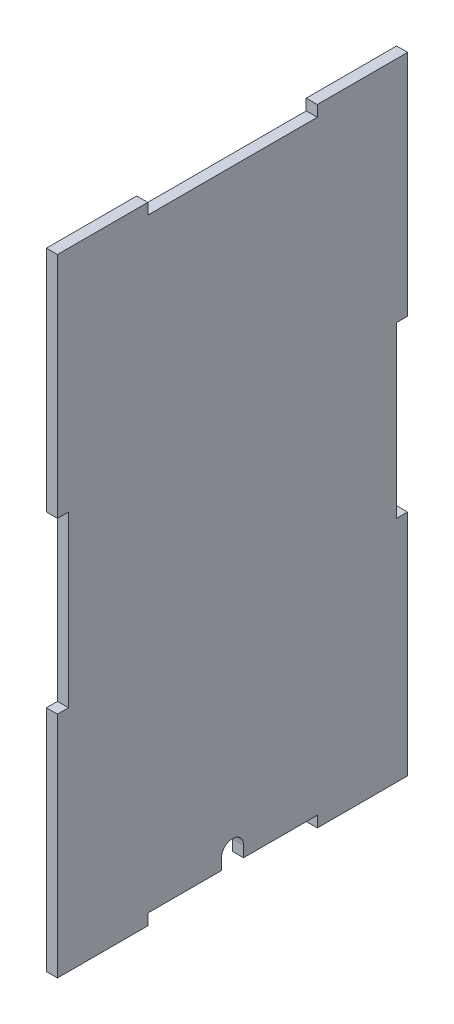
ISO-10303-21;
HEADER;
FILE_DESCRIPTION(('STEP AP214'),'2;1');
FILE_NAME('part.step','',(''),(''),'','','');
FILE_SCHEMA(('AUTOMOTIVE_DESIGN { 1 0 10303 214 1 1 1 1 }'));
ENDSEC;
DATA;
#1=APPLICATION_CONTEXT('core data for automotive mechanical design processes');
#2=APPLICATION_PROTOCOL_DEFINITION('international standard','automotive_design',2000,#1);
#3=PRODUCT_CONTEXT('',#1,'mechanical');
#4=PRODUCT('Part','Part','',(#3));
#5=PRODUCT_RELATED_PRODUCT_CATEGORY('part','',(#4));
#6=PRODUCT_DEFINITION_FORMATION('','',#4);
#7=PRODUCT_DEFINITION_CONTEXT('part definition',#1,'design');
#8=PRODUCT_DEFINITION('design','',#6,#7);
#9=PRODUCT_DEFINITION_SHAPE('','',#8);
#10=(LENGTH_UNIT() NAMED_UNIT(*) SI_UNIT(.MILLI.,.METRE.));
#11=(NAMED_UNIT(*) PLANE_ANGLE_UNIT() SI_UNIT($,.RADIAN.));
#12=(NAMED_UNIT(*) SI_UNIT($,.STERADIAN.) SOLID_ANGLE_UNIT());
#13=UNCERTAINTY_MEASURE_WITH_UNIT(LENGTH_MEASURE(1.E-05),#10,'distance_accuracy_value','');
#14=(GEOMETRIC_REPRESENTATION_CONTEXT(3) GLOBAL_UNCERTAINTY_ASSIGNED_CONTEXT((#13)) GLOBAL_UNIT_ASSIGNED_CONTEXT((#10,
#11,#12)) REPRESENTATION_CONTEXT('',''));
#15=CARTESIAN_POINT('',(0.,0.,0.));
#16=DIRECTION('',(0.,0.,1.));
#17=DIRECTION('',(1.,0.,0.));
#18=AXIS2_PLACEMENT_3D('',#15,#16,#17);
#19=CARTESIAN_POINT('',(3.,170.,0.));
#20=DIRECTION('',(0.,0.,-1.));
#21=DIRECTION('',(0.,1.,0.));
#22=AXIS2_PLACEMENT_3D('',#19,#20,#21);
#23=PLANE('',#22);
#24=DIRECTION('',(0.,-1.,0.));
#25=VECTOR('',#24,1.);
#26=CARTESIAN_POINT('',(0.,170.,0.));
#27=LINE('',#26,#25);
#28=CARTESIAN_POINT('',(0.,170.,0.));
#29=VERTEX_POINT('',#28);
#30=CARTESIAN_POINT('',(0.,108.,0.));
#31=VERTEX_POINT('',#30);
#32=EDGE_CURVE('E236',#29,#31,#27,.T.);
#33=ORIENTED_EDGE('',*,*,#32,.T.);
#34=DIRECTION('',(-1.,0.,0.));
#35=VECTOR('',#34,1.);
#36=CARTESIAN_POINT('',(3.,108.,0.));
#37=LINE('',#36,#35);
#38=CARTESIAN_POINT('',(3.,108.,0.));
#39=VERTEX_POINT('',#38);
#40=EDGE_CURVE('E11',#39,#31,#37,.T.);
#41=ORIENTED_EDGE('',*,*,#40,.F.);
#42=DIRECTION('',(0.,-1.,0.));
#43=VECTOR('',#42,1.);
#44=CARTESIAN_POINT('',(3.,170.,0.));
#45=LINE('',#44,#43);
#46=CARTESIAN_POINT('',(3.,170.,0.));
#47=VERTEX_POINT('',#46);
#48=EDGE_CURVE('E306',#47,#39,#45,.T.);
#49=ORIENTED_EDGE('',*,*,#48,.F.);
#50=DIRECTION('',(-1.,0.,0.));
#51=VECTOR('',#50,1.);
#52=CARTESIAN_POINT('',(3.,170.,0.));
#53=LINE('',#52,#51);
#54=EDGE_CURVE('E232',#47,#29,#53,.T.);
#55=ORIENTED_EDGE('',*,*,#54,.T.);
#56=EDGE_LOOP('',(#33,#41,#49,#55));
#57=FACE_BOUND('',#56,.T.);
#58=ADVANCED_FACE('F39',(#57),#23,.F.);
#59=CARTESIAN_POINT('',(3.,108.,-2.99999999999999));
#60=DIRECTION('',(0.,1.,0.));
#61=DIRECTION('',(0.,0.,1.));
#62=AXIS2_PLACEMENT_3D('',#59,#60,#61);
#63=PLANE('',#62);
#64=DIRECTION('',(0.,0.,-1.));
#65=VECTOR('',#64,1.);
#66=CARTESIAN_POINT('',(0.,108.,-2.99999999999999));
#67=LINE('',#66,#65);
#68=CARTESIAN_POINT('',(0.,108.,-2.99999999999999));
#69=VERTEX_POINT('',#68);
#70=EDGE_CURVE('E240',#31,#69,#67,.T.);
#71=ORIENTED_EDGE('',*,*,#70,.T.);
#72=DIRECTION('',(-1.,0.,0.));
#73=VECTOR('',#72,1.);
#74=CARTESIAN_POINT('',(3.,108.,-2.99999999999999));
#75=LINE('',#74,#73);
#76=CARTESIAN_POINT('',(3.,108.,-2.99999999999999));
#77=VERTEX_POINT('',#76);
#78=EDGE_CURVE('E48',#77,#69,#75,.T.);
#79=ORIENTED_EDGE('',*,*,#78,.F.);
#80=DIRECTION('',(0.,0.,-1.));
#81=VECTOR('',#80,1.);
#82=CARTESIAN_POINT('',(3.,108.,-2.99999999999999));
#83=LINE('',#82,#81);
#84=EDGE_CURVE('E147',#39,#77,#83,.T.);
#85=ORIENTED_EDGE('',*,*,#84,.F.);
#86=ORIENTED_EDGE('',*,*,#40,.T.);
#87=EDGE_LOOP('',(#71,#79,#85,#86));
#88=FACE_BOUND('',#87,.T.);
#89=ADVANCED_FACE('F484',(#88),#63,.F.);
#90=CARTESIAN_POINT('',(3.,62.,-2.99999999999999));
#91=DIRECTION('',(0.,0.,-1.));
#92=DIRECTION('',(-1.,0.,0.));
#93=AXIS2_PLACEMENT_3D('',#90,#91,#92);
#94=PLANE('',#93);
#95=DIRECTION('',(0.,-1.,0.));
#96=VECTOR('',#95,1.);
#97=CARTESIAN_POINT('',(0.,62.,-2.99999999999999));
#98=LINE('',#97,#96);
#99=CARTESIAN_POINT('',(0.,62.,-2.99999999999999));
#100=VERTEX_POINT('',#99);
#101=EDGE_CURVE('E243',#69,#100,#98,.T.);
#102=ORIENTED_EDGE('',*,*,#101,.T.);
#103=DIRECTION('',(-1.,0.,0.));
#104=VECTOR('',#103,1.);
#105=CARTESIAN_POINT('',(3.,62.,-2.99999999999999));
#106=LINE('',#105,#104);
#107=CARTESIAN_POINT('',(3.,62.,-2.99999999999999));
#108=VERTEX_POINT('',#107);
#109=EDGE_CURVE('E381',#108,#100,#106,.T.);
#110=ORIENTED_EDGE('',*,*,#109,.F.);
#111=DIRECTION('',(0.,-1.,0.));
#112=VECTOR('',#111,1.);
#113=CARTESIAN_POINT('',(3.,62.,-2.99999999999999));
#114=LINE('',#113,#112);
#115=EDGE_CURVE('E391',#77,#108,#114,.T.);
#116=ORIENTED_EDGE('',*,*,#115,.F.);
#117=ORIENTED_EDGE('',*,*,#78,.T.);
#118=EDGE_LOOP('',(#102,#110,#116,#117));
#119=FACE_BOUND('',#118,.T.);
#120=ADVANCED_FACE('F389',(#119),#94,.F.);
#121=CARTESIAN_POINT('',(3.,62.,-2.99999999999999));
#122=DIRECTION('',(0.,-1.,0.));
#123=DIRECTION('',(0.,0.,-1.));
#124=AXIS2_PLACEMENT_3D('',#121,#122,#123);
#125=PLANE('',#124);
#126=DIRECTION('',(0.,0.,1.));
#127=VECTOR('',#126,1.);
#128=CARTESIAN_POINT('',(0.,62.,-2.99999999999999));
#129=LINE('',#128,#127);
#130=CARTESIAN_POINT('',(0.,62.,0.));
#131=VERTEX_POINT('',#130);
#132=EDGE_CURVE('E246',#100,#131,#129,.T.);
#133=ORIENTED_EDGE('',*,*,#132,.T.);
#134=DIRECTION('',(-1.,0.,0.));
#135=VECTOR('',#134,1.);
#136=CARTESIAN_POINT('',(3.,62.,0.));
#137=LINE('',#136,#135);
#138=CARTESIAN_POINT('',(3.,62.,0.));
#139=VERTEX_POINT('',#138);
#140=EDGE_CURVE('E377',#139,#131,#137,.T.);
#141=ORIENTED_EDGE('',*,*,#140,.F.);
#142=DIRECTION('',(0.,0.,1.));
#143=VECTOR('',#142,1.);
#144=CARTESIAN_POINT('',(3.,62.,-2.99999999999999));
#145=LINE('',#144,#143);
#146=EDGE_CURVE('E410',#108,#139,#145,.T.);
#147=ORIENTED_EDGE('',*,*,#146,.F.);
#148=ORIENTED_EDGE('',*,*,#109,.T.);
#149=EDGE_LOOP('',(#133,#141,#147,#148));
#150=FACE_BOUND('',#149,.T.);
#151=ADVANCED_FACE('F400',(#150),#125,.F.);
#152=CARTESIAN_POINT('',(3.,62.,0.));
#153=DIRECTION('',(0.,0.,-1.));
#154=DIRECTION('',(0.,1.,0.));
#155=AXIS2_PLACEMENT_3D('',#152,#153,#154);
#156=PLANE('',#155);
#157=DIRECTION('',(0.,-1.,0.));
#158=VECTOR('',#157,1.);
#159=CARTESIAN_POINT('',(0.,62.,0.));
#160=LINE('',#159,#158);
#161=CARTESIAN_POINT('',(0.,0.,0.));
#162=VERTEX_POINT('',#161);
#163=EDGE_CURVE('E249',#131,#162,#160,.T.);
#164=ORIENTED_EDGE('',*,*,#163,.T.);
#165=DIRECTION('',(-1.,0.,0.));
#166=VECTOR('',#165,1.);
#167=CARTESIAN_POINT('',(3.,0.,0.));
#168=LINE('',#167,#166);
#169=CARTESIAN_POINT('',(3.,0.,0.));
#170=VERTEX_POINT('',#169);
#171=EDGE_CURVE('E373',#170,#162,#168,.T.);
#172=ORIENTED_EDGE('',*,*,#171,.F.);
#173=DIRECTION('',(0.,-1.,0.));
#174=VECTOR('',#173,1.);
#175=CARTESIAN_POINT('',(3.,62.,0.));
#176=LINE('',#175,#174);
#177=EDGE_CURVE('E406',#139,#170,#176,.T.);
#178=ORIENTED_EDGE('',*,*,#177,.F.);
#179=ORIENTED_EDGE('',*,*,#140,.T.);
#180=EDGE_LOOP('',(#164,#172,#178,#179));
#181=FACE_BOUND('',#180,.T.);
#182=ADVANCED_FACE('F404',(#181),#156,.F.);
#183=CARTESIAN_POINT('',(3.,0.,0.));
#184=DIRECTION('',(0.,1.,0.));
#185=DIRECTION('',(0.,0.,1.));
#186=AXIS2_PLACEMENT_3D('',#183,#184,#185);
#187=PLANE('',#186);
#188=DIRECTION('',(0.,0.,-1.));
#189=VECTOR('',#188,1.);
#190=CARTESIAN_POINT('',(0.,0.,0.));
#191=LINE('',#190,#189);
#192=CARTESIAN_POINT('',(0.,0.,-24.4999999999999));
#193=VERTEX_POINT('',#192);
#194=EDGE_CURVE('E252',#162,#193,#191,.T.);
#195=ORIENTED_EDGE('',*,*,#194,.T.);
#196=DIRECTION('',(-1.,0.,0.));
#197=VECTOR('',#196,1.);
#198=CARTESIAN_POINT('',(3.,0.,-24.4999999999999));
#199=LINE('',#198,#197);
#200=CARTESIAN_POINT('',(3.,0.,-24.4999999999999));
#201=VERTEX_POINT('',#200);
#202=EDGE_CURVE('E369',#201,#193,#199,.T.);
#203=ORIENTED_EDGE('',*,*,#202,.F.);
#204=DIRECTION('',(0.,0.,-1.));
#205=VECTOR('',#204,1.);
#206=CARTESIAN_POINT('',(3.,0.,0.));
#207=LINE('',#206,#205);
#208=EDGE_CURVE('E409',#170,#201,#207,.T.);
#209=ORIENTED_EDGE('',*,*,#208,.F.);
#210=ORIENTED_EDGE('',*,*,#171,.T.);
#211=EDGE_LOOP('',(#195,#203,#209,#210));
#212=FACE_BOUND('',#211,.T.);
#213=ADVANCED_FACE('F497',(#212),#187,.F.);
#214=CARTESIAN_POINT('',(3.,3.00000000000002,-24.4999999999999));
#215=DIRECTION('',(0.,0.,1.));
#216=DIRECTION('',(1.,0.,0.));
#217=AXIS2_PLACEMENT_3D('',#214,#215,#216);
#218=PLANE('',#217);
#219=DIRECTION('',(0.,1.,0.));
#220=VECTOR('',#219,1.);
#221=CARTESIAN_POINT('',(0.,3.00000000000002,-24.4999999999999));
#222=LINE('',#221,#220);
#223=CARTESIAN_POINT('',(0.,3.00000000000002,-24.4999999999999));
#224=VERTEX_POINT('',#223);
#225=EDGE_CURVE('E255',#193,#224,#222,.T.);
#226=ORIENTED_EDGE('',*,*,#225,.T.);
#227=DIRECTION('',(-1.,0.,0.));
#228=VECTOR('',#227,1.);
#229=CARTESIAN_POINT('',(3.,3.00000000000002,-24.4999999999999));
#230=LINE('',#229,#228);
#231=CARTESIAN_POINT('',(3.,3.00000000000002,-24.4999999999999));
#232=VERTEX_POINT('',#231);
#233=EDGE_CURVE('E365',#232,#224,#230,.T.);
#234=ORIENTED_EDGE('',*,*,#233,.F.);
#235=DIRECTION('',(0.,1.,0.));
#236=VECTOR('',#235,1.);
#237=CARTESIAN_POINT('',(3.,3.00000000000002,-24.4999999999999));
#238=LINE('',#237,#236);
#239=EDGE_CURVE('E414',#201,#232,#238,.T.);
#240=ORIENTED_EDGE('',*,*,#239,.F.);
#241=ORIENTED_EDGE('',*,*,#202,.T.);
#242=EDGE_LOOP('',(#226,#234,#240,#241));
#243=FACE_BOUND('',#242,.T.);
#244=ADVANCED_FACE('F500',(#243),#218,.F.);
#245=CARTESIAN_POINT('',(3.,3.00000000000002,-24.4999999999999));
#246=DIRECTION('',(0.,1.,0.));
#247=DIRECTION('',(0.,0.,1.));
#248=AXIS2_PLACEMENT_3D('',#245,#246,#247);
#249=PLANE('',#248);
#250=DIRECTION('',(0.,0.,-1.));
#251=VECTOR('',#250,1.);
#252=CARTESIAN_POINT('',(0.,3.00000000000002,-24.4999999999999));
#253=LINE('',#252,#251);
#254=CARTESIAN_POINT('',(0.,3.00000000000002,-44.5000000000001));
#255=VERTEX_POINT('',#254);
#256=EDGE_CURVE('E258',#224,#255,#253,.T.);
#257=ORIENTED_EDGE('',*,*,#256,.T.);
#258=DIRECTION('',(-1.,0.,0.));
#259=VECTOR('',#258,1.);
#260=CARTESIAN_POINT('',(3.,3.00000000000002,-44.5000000000001));
#261=LINE('',#260,#259);
#262=CARTESIAN_POINT('',(3.,3.00000000000002,-44.5000000000001));
#263=VERTEX_POINT('',#262);
#264=EDGE_CURVE('E361',#263,#255,#261,.T.);
#265=ORIENTED_EDGE('',*,*,#264,.F.);
#266=DIRECTION('',(0.,0.,-1.));
#267=VECTOR('',#266,1.);
#268=CARTESIAN_POINT('',(3.,3.00000000000002,-24.4999999999999));
#269=LINE('',#268,#267);
#270=EDGE_CURVE('E421',#232,#263,#269,.T.);
#271=ORIENTED_EDGE('',*,*,#270,.F.);
#272=ORIENTED_EDGE('',*,*,#233,.T.);
#273=EDGE_LOOP('',(#257,#265,#271,#272));
#274=FACE_BOUND('',#273,.T.);
#275=ADVANCED_FACE('F504',(#274),#249,.F.);
#276=CARTESIAN_POINT('',(3.,3.00000000000002,-44.5000000000001));
#277=DIRECTION('',(0.,0.,1.));
#278=DIRECTION('',(1.,0.,0.));
#279=AXIS2_PLACEMENT_3D('',#276,#277,#278);
#280=PLANE('',#279);
#281=DIRECTION('',(0.,1.,0.));
#282=VECTOR('',#281,1.);
#283=CARTESIAN_POINT('',(0.,3.00000000000002,-44.5000000000001));
#284=LINE('',#283,#282);
#285=CARTESIAN_POINT('',(0.,6.00000000000002,-44.5000000000001));
#286=VERTEX_POINT('',#285);
#287=EDGE_CURVE('E261',#255,#286,#284,.T.);
#288=ORIENTED_EDGE('',*,*,#287,.T.);
#289=DIRECTION('',(-1.,0.,0.));
#290=VECTOR('',#289,1.);
#291=CARTESIAN_POINT('',(3.,6.00000000000002,-44.5000000000001));
#292=LINE('',#291,#290);
#293=CARTESIAN_POINT('',(3.,6.00000000000002,-44.5000000000001));
#294=VERTEX_POINT('',#293);
#295=EDGE_CURVE('E357',#294,#286,#292,.T.);
#296=ORIENTED_EDGE('',*,*,#295,.F.);
#297=DIRECTION('',(0.,1.,0.));
#298=VECTOR('',#297,1.);
#299=CARTESIAN_POINT('',(3.,3.00000000000002,-44.5000000000001));
#300=LINE('',#299,#298);
#301=EDGE_CURVE('E424',#263,#294,#300,.T.);
#302=ORIENTED_EDGE('',*,*,#301,.F.);
#303=ORIENTED_EDGE('',*,*,#264,.T.);
#304=EDGE_LOOP('',(#288,#296,#302,#303));
#305=FACE_BOUND('',#304,.T.);
#306=ADVANCED_FACE('F508',(#305),#280,.F.);
#307=CARTESIAN_POINT('',(3.,6.00000000000002,-47.5000000000001));
#308=DIRECTION('',(-1.,0.,0.));
#309=DIRECTION('',(0.,0.,1.));
#310=AXIS2_PLACEMENT_3D('',#307,#308,#309);
#311=CYLINDRICAL_SURFACE('',#310,3.);
#312=CARTESIAN_POINT('',(0.,6.00000000000002,-47.5000000000001));
#313=DIRECTION('',(-1.,0.,0.));
#314=DIRECTION('',(0.,0.,1.));
#315=AXIS2_PLACEMENT_3D('',#312,#313,#314);
#316=CIRCLE('',#315,3.);
#317=CARTESIAN_POINT('',(0.,6.00000000000002,-50.5000000000001));
#318=VERTEX_POINT('',#317);
#319=EDGE_CURVE('E264',#286,#318,#316,.T.);
#320=ORIENTED_EDGE('',*,*,#319,.T.);
#321=DIRECTION('',(-1.,0.,0.));
#322=VECTOR('',#321,1.);
#323=CARTESIAN_POINT('',(3.,6.00000000000002,-50.5000000000001));
#324=LINE('',#323,#322);
#325=CARTESIAN_POINT('',(3.,6.00000000000002,-50.5000000000001));
#326=VERTEX_POINT('',#325);
#327=EDGE_CURVE('E353',#326,#318,#324,.T.);
#328=ORIENTED_EDGE('',*,*,#327,.F.);
#329=CARTESIAN_POINT('',(3.,6.00000000000002,-47.5000000000001));
#330=DIRECTION('',(-1.,0.,0.));
#331=DIRECTION('',(0.,0.,1.));
#332=AXIS2_PLACEMENT_3D('',#329,#330,#331);
#333=CIRCLE('',#332,3.);
#334=EDGE_CURVE('E427',#294,#326,#333,.T.);
#335=ORIENTED_EDGE('',*,*,#334,.F.);
#336=ORIENTED_EDGE('',*,*,#295,.T.);
#337=EDGE_LOOP('',(#320,#328,#335,#336));
#338=FACE_BOUND('',#337,.T.);
#339=ADVANCED_FACE('F512',(#338),#311,.F.);
#340=CARTESIAN_POINT('',(3.,3.00000000000002,-50.5000000000001));
#341=DIRECTION('',(0.,0.,-1.));
#342=DIRECTION('',(-1.,0.,0.));
#343=AXIS2_PLACEMENT_3D('',#340,#341,#342);
#344=PLANE('',#343);
#345=DIRECTION('',(0.,-1.,0.));
#346=VECTOR('',#345,1.);
#347=CARTESIAN_POINT('',(0.,3.00000000000002,-50.5000000000001));
#348=LINE('',#347,#346);
#349=CARTESIAN_POINT('',(0.,3.00000000000002,-50.5000000000001));
#350=VERTEX_POINT('',#349);
#351=EDGE_CURVE('E267',#318,#350,#348,.T.);
#352=ORIENTED_EDGE('',*,*,#351,.T.);
#353=DIRECTION('',(-1.,0.,0.));
#354=VECTOR('',#353,1.);
#355=CARTESIAN_POINT('',(3.,3.00000000000002,-50.5000000000001));
#356=LINE('',#355,#354);
#357=CARTESIAN_POINT('',(3.,3.00000000000002,-50.5000000000001));
#358=VERTEX_POINT('',#357);
#359=EDGE_CURVE('E349',#358,#350,#356,.T.);
#360=ORIENTED_EDGE('',*,*,#359,.F.);
#361=DIRECTION('',(0.,-1.,0.));
#362=VECTOR('',#361,1.);
#363=CARTESIAN_POINT('',(3.,3.00000000000002,-50.5000000000001));
#364=LINE('',#363,#362);
#365=EDGE_CURVE('E430',#326,#358,#364,.T.);
#366=ORIENTED_EDGE('',*,*,#365,.F.);
#367=ORIENTED_EDGE('',*,*,#327,.T.);
#368=EDGE_LOOP('',(#352,#360,#366,#367));
#369=FACE_BOUND('',#368,.T.);
#370=ADVANCED_FACE('F516',(#369),#344,.F.);
#371=CARTESIAN_POINT('',(3.,3.00000000000002,-50.5000000000001));
#372=DIRECTION('',(0.,1.,0.));
#373=DIRECTION('',(0.,0.,1.));
#374=AXIS2_PLACEMENT_3D('',#371,#372,#373);
#375=PLANE('',#374);
#376=DIRECTION('',(0.,0.,-1.));
#377=VECTOR('',#376,1.);
#378=CARTESIAN_POINT('',(0.,3.00000000000002,-50.5000000000001));
#379=LINE('',#378,#377);
#380=CARTESIAN_POINT('',(0.,3.,-70.4999999999999));
#381=VERTEX_POINT('',#380);
#382=EDGE_CURVE('E270',#350,#381,#379,.T.);
#383=ORIENTED_EDGE('',*,*,#382,.T.);
#384=DIRECTION('',(-1.,0.,0.));
#385=VECTOR('',#384,1.);
#386=CARTESIAN_POINT('',(3.,3.,-70.4999999999999));
#387=LINE('',#386,#385);
#388=CARTESIAN_POINT('',(3.,3.,-70.4999999999999));
#389=VERTEX_POINT('',#388);
#390=EDGE_CURVE('E345',#389,#381,#387,.T.);
#391=ORIENTED_EDGE('',*,*,#390,.F.);
#392=DIRECTION('',(0.,0.,-1.));
#393=VECTOR('',#392,1.);
#394=CARTESIAN_POINT('',(3.,3.00000000000002,-50.5000000000001));
#395=LINE('',#394,#393);
#396=EDGE_CURVE('E433',#358,#389,#395,.T.);
#397=ORIENTED_EDGE('',*,*,#396,.F.);
#398=ORIENTED_EDGE('',*,*,#359,.T.);
#399=EDGE_LOOP('',(#383,#391,#397,#398));
#400=FACE_BOUND('',#399,.T.);
#401=ADVANCED_FACE('F520',(#400),#375,.F.);
#402=CARTESIAN_POINT('',(3.,3.,-70.4999999999999));
#403=DIRECTION('',(0.,0.,-1.));
#404=DIRECTION('',(0.,1.,0.));
#405=AXIS2_PLACEMENT_3D('',#402,#403,#404);
#406=PLANE('',#405);
#407=DIRECTION('',(0.,-1.,0.));
#408=VECTOR('',#407,1.);
#409=CARTESIAN_POINT('',(0.,3.,-70.4999999999999));
#410=LINE('',#409,#408);
#411=CARTESIAN_POINT('',(0.,0.,-70.4999999999999));
#412=VERTEX_POINT('',#411);
#413=EDGE_CURVE('E273',#381,#412,#410,.T.);
#414=ORIENTED_EDGE('',*,*,#413,.T.);
#415=DIRECTION('',(-1.,0.,0.));
#416=VECTOR('',#415,1.);
#417=CARTESIAN_POINT('',(3.,0.,-70.4999999999999));
#418=LINE('',#417,#416);
#419=CARTESIAN_POINT('',(3.,0.,-70.4999999999999));
#420=VERTEX_POINT('',#419);
#421=EDGE_CURVE('E341',#420,#412,#418,.T.);
#422=ORIENTED_EDGE('',*,*,#421,.F.);
#423=DIRECTION('',(0.,-1.,0.));
#424=VECTOR('',#423,1.);
#425=CARTESIAN_POINT('',(3.,3.,-70.4999999999999));
#426=LINE('',#425,#424);
#427=EDGE_CURVE('E436',#389,#420,#426,.T.);
#428=ORIENTED_EDGE('',*,*,#427,.F.);
#429=ORIENTED_EDGE('',*,*,#390,.T.);
#430=EDGE_LOOP('',(#414,#422,#428,#429));
#431=FACE_BOUND('',#430,.T.);
#432=ADVANCED_FACE('F524',(#431),#406,.F.);
#433=CARTESIAN_POINT('',(3.,0.,-70.4999999999999));
#434=DIRECTION('',(0.,1.,0.));
#435=DIRECTION('',(0.,0.,1.));
#436=AXIS2_PLACEMENT_3D('',#433,#434,#435);
#437=PLANE('',#436);
#438=DIRECTION('',(0.,0.,-1.));
#439=VECTOR('',#438,1.);
#440=CARTESIAN_POINT('',(0.,0.,-70.4999999999999));
#441=LINE('',#440,#439);
#442=CARTESIAN_POINT('',(0.,0.,-95.));
#443=VERTEX_POINT('',#442);
#444=EDGE_CURVE('E276',#412,#443,#441,.T.);
#445=ORIENTED_EDGE('',*,*,#444,.T.);
#446=DIRECTION('',(-1.,0.,0.));
#447=VECTOR('',#446,1.);
#448=CARTESIAN_POINT('',(3.,0.,-95.));
#449=LINE('',#448,#447);
#450=CARTESIAN_POINT('',(3.,0.,-95.));
#451=VERTEX_POINT('',#450);
#452=EDGE_CURVE('E337',#451,#443,#449,.T.);
#453=ORIENTED_EDGE('',*,*,#452,.F.);
#454=DIRECTION('',(0.,0.,-1.));
#455=VECTOR('',#454,1.);
#456=CARTESIAN_POINT('',(3.,0.,-70.4999999999999));
#457=LINE('',#456,#455);
#458=EDGE_CURVE('E439',#420,#451,#457,.T.);
#459=ORIENTED_EDGE('',*,*,#458,.F.);
#460=ORIENTED_EDGE('',*,*,#421,.T.);
#461=EDGE_LOOP('',(#445,#453,#459,#460));
#462=FACE_BOUND('',#461,.T.);
#463=ADVANCED_FACE('F528',(#462),#437,.F.);
#464=CARTESIAN_POINT('',(3.,61.9999999999999,-95.));
#465=DIRECTION('',(0.,0.,1.));
#466=DIRECTION('',(0.,-1.,0.));
#467=AXIS2_PLACEMENT_3D('',#464,#465,#466);
#468=PLANE('',#467);
#469=DIRECTION('',(0.,1.,0.));
#470=VECTOR('',#469,1.);
#471=CARTESIAN_POINT('',(0.,61.9999999999999,-95.));
#472=LINE('',#471,#470);
#473=CARTESIAN_POINT('',(0.,61.9999999999999,-95.));
#474=VERTEX_POINT('',#473);
#475=EDGE_CURVE('E279',#443,#474,#472,.T.);
#476=ORIENTED_EDGE('',*,*,#475,.T.);
#477=DIRECTION('',(-1.,0.,0.));
#478=VECTOR('',#477,1.);
#479=CARTESIAN_POINT('',(3.,61.9999999999999,-95.));
#480=LINE('',#479,#478);
#481=CARTESIAN_POINT('',(3.,61.9999999999999,-95.));
#482=VERTEX_POINT('',#481);
#483=EDGE_CURVE('E333',#482,#474,#480,.T.);
#484=ORIENTED_EDGE('',*,*,#483,.F.);
#485=DIRECTION('',(0.,1.,0.));
#486=VECTOR('',#485,1.);
#487=CARTESIAN_POINT('',(3.,61.9999999999999,-95.));
#488=LINE('',#487,#486);
#489=EDGE_CURVE('E442',#451,#482,#488,.T.);
#490=ORIENTED_EDGE('',*,*,#489,.F.);
#491=ORIENTED_EDGE('',*,*,#452,.T.);
#492=EDGE_LOOP('',(#476,#484,#490,#491));
#493=FACE_BOUND('',#492,.T.);
#494=ADVANCED_FACE('F532',(#493),#468,.F.);
#495=CARTESIAN_POINT('',(3.,61.9999999999999,-92.));
#496=DIRECTION('',(0.,-1.,0.));
#497=DIRECTION('',(0.,0.,-1.));
#498=AXIS2_PLACEMENT_3D('',#495,#496,#497);
#499=PLANE('',#498);
#500=DIRECTION('',(0.,0.,1.));
#501=VECTOR('',#500,1.);
#502=CARTESIAN_POINT('',(0.,61.9999999999999,-92.));
#503=LINE('',#502,#501);
#504=CARTESIAN_POINT('',(0.,61.9999999999999,-92.));
#505=VERTEX_POINT('',#504);
#506=EDGE_CURVE('E282',#474,#505,#503,.T.);
#507=ORIENTED_EDGE('',*,*,#506,.T.);
#508=DIRECTION('',(-1.,0.,0.));
#509=VECTOR('',#508,1.);
#510=CARTESIAN_POINT('',(3.,61.9999999999999,-92.));
#511=LINE('',#510,#509);
#512=CARTESIAN_POINT('',(3.,61.9999999999999,-92.));
#513=VERTEX_POINT('',#512);
#514=EDGE_CURVE('E329',#513,#505,#511,.T.);
#515=ORIENTED_EDGE('',*,*,#514,.F.);
#516=DIRECTION('',(0.,0.,1.));
#517=VECTOR('',#516,1.);
#518=CARTESIAN_POINT('',(3.,61.9999999999999,-92.));
#519=LINE('',#518,#517);
#520=EDGE_CURVE('E445',#482,#513,#519,.T.);
#521=ORIENTED_EDGE('',*,*,#520,.F.);
#522=ORIENTED_EDGE('',*,*,#483,.T.);
#523=EDGE_LOOP('',(#507,#515,#521,#522));
#524=FACE_BOUND('',#523,.T.);
#525=ADVANCED_FACE('F536',(#524),#499,.F.);
#526=CARTESIAN_POINT('',(3.,61.9999999999999,-92.));
#527=DIRECTION('',(0.,0.,1.));
#528=DIRECTION('',(1.,0.,0.));
#529=AXIS2_PLACEMENT_3D('',#526,#527,#528);
#530=PLANE('',#529);
#531=DIRECTION('',(0.,1.,0.));
#532=VECTOR('',#531,1.);
#533=CARTESIAN_POINT('',(0.,61.9999999999999,-92.));
#534=LINE('',#533,#532);
#535=CARTESIAN_POINT('',(0.,108.,-92.));
#536=VERTEX_POINT('',#535);
#537=EDGE_CURVE('E285',#505,#536,#534,.T.);
#538=ORIENTED_EDGE('',*,*,#537,.T.);
#539=DIRECTION('',(-1.,0.,0.));
#540=VECTOR('',#539,1.);
#541=CARTESIAN_POINT('',(3.,108.,-92.));
#542=LINE('',#541,#540);
#543=CARTESIAN_POINT('',(3.,108.,-92.));
#544=VERTEX_POINT('',#543);
#545=EDGE_CURVE('E325',#544,#536,#542,.T.);
#546=ORIENTED_EDGE('',*,*,#545,.F.);
#547=DIRECTION('',(0.,1.,0.));
#548=VECTOR('',#547,1.);
#549=CARTESIAN_POINT('',(3.,61.9999999999999,-92.));
#550=LINE('',#549,#548);
#551=EDGE_CURVE('E448',#513,#544,#550,.T.);
#552=ORIENTED_EDGE('',*,*,#551,.F.);
#553=ORIENTED_EDGE('',*,*,#514,.T.);
#554=EDGE_LOOP('',(#538,#546,#552,#553));
#555=FACE_BOUND('',#554,.T.);
#556=ADVANCED_FACE('F540',(#555),#530,.F.);
#557=CARTESIAN_POINT('',(3.,108.,-92.));
#558=DIRECTION('',(0.,1.,0.));
#559=DIRECTION('',(0.,0.,1.));
#560=AXIS2_PLACEMENT_3D('',#557,#558,#559);
#561=PLANE('',#560);
#562=DIRECTION('',(0.,0.,-1.));
#563=VECTOR('',#562,1.);
#564=CARTESIAN_POINT('',(0.,108.,-92.));
#565=LINE('',#564,#563);
#566=CARTESIAN_POINT('',(0.,108.,-95.));
#567=VERTEX_POINT('',#566);
#568=EDGE_CURVE('E288',#536,#567,#565,.T.);
#569=ORIENTED_EDGE('',*,*,#568,.T.);
#570=DIRECTION('',(-1.,0.,0.));
#571=VECTOR('',#570,1.);
#572=CARTESIAN_POINT('',(3.,108.,-95.));
#573=LINE('',#572,#571);
#574=CARTESIAN_POINT('',(3.,108.,-95.));
#575=VERTEX_POINT('',#574);
#576=EDGE_CURVE('E321',#575,#567,#573,.T.);
#577=ORIENTED_EDGE('',*,*,#576,.F.);
#578=DIRECTION('',(0.,0.,-1.));
#579=VECTOR('',#578,1.);
#580=CARTESIAN_POINT('',(3.,108.,-92.));
#581=LINE('',#580,#579);
#582=EDGE_CURVE('E451',#544,#575,#581,.T.);
#583=ORIENTED_EDGE('',*,*,#582,.F.);
#584=ORIENTED_EDGE('',*,*,#545,.T.);
#585=EDGE_LOOP('',(#569,#577,#583,#584));
#586=FACE_BOUND('',#585,.T.);
#587=ADVANCED_FACE('F544',(#586),#561,.F.);
#588=CARTESIAN_POINT('',(3.,170.,-95.));
#589=DIRECTION('',(0.,0.,1.));
#590=DIRECTION('',(1.,0.,0.));
#591=AXIS2_PLACEMENT_3D('',#588,#589,#590);
#592=PLANE('',#591);
#593=DIRECTION('',(0.,1.,0.));
#594=VECTOR('',#593,1.);
#595=CARTESIAN_POINT('',(0.,170.,-95.));
#596=LINE('',#595,#594);
#597=CARTESIAN_POINT('',(0.,170.,-95.));
#598=VERTEX_POINT('',#597);
#599=EDGE_CURVE('E291',#567,#598,#596,.T.);
#600=ORIENTED_EDGE('',*,*,#599,.T.);
#601=DIRECTION('',(-1.,0.,0.));
#602=VECTOR('',#601,1.);
#603=CARTESIAN_POINT('',(3.,170.,-95.));
#604=LINE('',#603,#602);
#605=CARTESIAN_POINT('',(3.,170.,-95.));
#606=VERTEX_POINT('',#605);
#607=EDGE_CURVE('E317',#606,#598,#604,.T.);
#608=ORIENTED_EDGE('',*,*,#607,.F.);
#609=DIRECTION('',(0.,1.,0.));
#610=VECTOR('',#609,1.);
#611=CARTESIAN_POINT('',(3.,170.,-95.));
#612=LINE('',#611,#610);
#613=EDGE_CURVE('E454',#575,#606,#612,.T.);
#614=ORIENTED_EDGE('',*,*,#613,.F.);
#615=ORIENTED_EDGE('',*,*,#576,.T.);
#616=EDGE_LOOP('',(#600,#608,#614,#615));
#617=FACE_BOUND('',#616,.T.);
#618=ADVANCED_FACE('F548',(#617),#592,.F.);
#619=CARTESIAN_POINT('',(3.,170.,-70.5000000000001));
#620=DIRECTION('',(0.,-1.,0.));
#621=DIRECTION('',(0.,0.,-1.));
#622=AXIS2_PLACEMENT_3D('',#619,#620,#621);
#623=PLANE('',#622);
#624=DIRECTION('',(0.,0.,1.));
#625=VECTOR('',#624,1.);
#626=CARTESIAN_POINT('',(0.,170.,-70.5000000000001));
#627=LINE('',#626,#625);
#628=CARTESIAN_POINT('',(0.,170.,-70.5000000000001));
#629=VERTEX_POINT('',#628);
#630=EDGE_CURVE('E294',#598,#629,#627,.T.);
#631=ORIENTED_EDGE('',*,*,#630,.T.);
#632=DIRECTION('',(-1.,0.,0.));
#633=VECTOR('',#632,1.);
#634=CARTESIAN_POINT('',(3.,170.,-70.5000000000001));
#635=LINE('',#634,#633);
#636=CARTESIAN_POINT('',(3.,170.,-70.5000000000001));
#637=VERTEX_POINT('',#636);
#638=EDGE_CURVE('E313',#637,#629,#635,.T.);
#639=ORIENTED_EDGE('',*,*,#638,.F.);
#640=DIRECTION('',(0.,0.,1.));
#641=VECTOR('',#640,1.);
#642=CARTESIAN_POINT('',(3.,170.,-70.5000000000001));
#643=LINE('',#642,#641);
#644=EDGE_CURVE('E457',#606,#637,#643,.T.);
#645=ORIENTED_EDGE('',*,*,#644,.F.);
#646=ORIENTED_EDGE('',*,*,#607,.T.);
#647=EDGE_LOOP('',(#631,#639,#645,#646));
#648=FACE_BOUND('',#647,.T.);
#649=ADVANCED_FACE('F465',(#648),#623,.F.);
#650=CARTESIAN_POINT('',(3.,167.,-70.5000000000001));
#651=DIRECTION('',(0.,0.,-1.));
#652=DIRECTION('',(-1.,0.,0.));
#653=AXIS2_PLACEMENT_3D('',#650,#651,#652);
#654=PLANE('',#653);
#655=DIRECTION('',(0.,-1.,0.));
#656=VECTOR('',#655,1.);
#657=CARTESIAN_POINT('',(0.,167.,-70.5000000000001));
#658=LINE('',#657,#656);
#659=CARTESIAN_POINT('',(0.,167.,-70.5000000000001));
#660=VERTEX_POINT('',#659);
#661=EDGE_CURVE('E297',#629,#660,#658,.T.);
#662=ORIENTED_EDGE('',*,*,#661,.T.);
#663=DIRECTION('',(-1.,0.,0.));
#664=VECTOR('',#663,1.);
#665=CARTESIAN_POINT('',(3.,167.,-70.5000000000001));
#666=LINE('',#665,#664);
#667=CARTESIAN_POINT('',(3.,167.,-70.5000000000001));
#668=VERTEX_POINT('',#667);
#669=EDGE_CURVE('E225',#668,#660,#666,.T.);
#670=ORIENTED_EDGE('',*,*,#669,.F.);
#671=DIRECTION('',(0.,-1.,0.));
#672=VECTOR('',#671,1.);
#673=CARTESIAN_POINT('',(3.,167.,-70.5000000000001));
#674=LINE('',#673,#672);
#675=EDGE_CURVE('E214',#637,#668,#674,.T.);
#676=ORIENTED_EDGE('',*,*,#675,.F.);
#677=ORIENTED_EDGE('',*,*,#638,.T.);
#678=EDGE_LOOP('',(#662,#670,#676,#677));
#679=FACE_BOUND('',#678,.T.);
#680=ADVANCED_FACE('F469',(#679),#654,.F.);
#681=CARTESIAN_POINT('',(3.,167.,-24.5000000000001));
#682=DIRECTION('',(0.,-1.,0.));
#683=DIRECTION('',(0.,0.,-1.));
#684=AXIS2_PLACEMENT_3D('',#681,#682,#683);
#685=PLANE('',#684);
#686=DIRECTION('',(0.,0.,1.));
#687=VECTOR('',#686,1.);
#688=CARTESIAN_POINT('',(0.,167.,-24.5000000000001));
#689=LINE('',#688,#687);
#690=CARTESIAN_POINT('',(0.,167.,-24.5000000000001));
#691=VERTEX_POINT('',#690);
#692=EDGE_CURVE('E223',#660,#691,#689,.T.);
#693=ORIENTED_EDGE('',*,*,#692,.T.);
#694=DIRECTION('',(-1.,0.,0.));
#695=VECTOR('',#694,1.);
#696=CARTESIAN_POINT('',(3.,167.,-24.5000000000001));
#697=LINE('',#696,#695);
#698=CARTESIAN_POINT('',(3.,167.,-24.5000000000001));
#699=VERTEX_POINT('',#698);
#700=EDGE_CURVE('E220',#699,#691,#697,.T.);
#701=ORIENTED_EDGE('',*,*,#700,.F.);
#702=DIRECTION('',(0.,0.,1.));
#703=VECTOR('',#702,1.);
#704=CARTESIAN_POINT('',(3.,167.,-24.5000000000001));
#705=LINE('',#704,#703);
#706=EDGE_CURVE('E208',#668,#699,#705,.T.);
#707=ORIENTED_EDGE('',*,*,#706,.F.);
#708=ORIENTED_EDGE('',*,*,#669,.T.);
#709=EDGE_LOOP('',(#693,#701,#707,#708));
#710=FACE_BOUND('',#709,.T.);
#711=ADVANCED_FACE('F221',(#710),#685,.F.);
#712=CARTESIAN_POINT('',(3.,167.,-24.5000000000001));
#713=DIRECTION('',(0.,0.,1.));
#714=DIRECTION('',(1.,0.,0.));
#715=AXIS2_PLACEMENT_3D('',#712,#713,#714);
#716=PLANE('',#715);
#717=DIRECTION('',(0.,1.,0.));
#718=VECTOR('',#717,1.);
#719=CARTESIAN_POINT('',(0.,167.,-24.5000000000001));
#720=LINE('',#719,#718);
#721=CARTESIAN_POINT('',(0.,170.,-24.5000000000001));
#722=VERTEX_POINT('',#721);
#723=EDGE_CURVE('E133',#691,#722,#720,.T.);
#724=ORIENTED_EDGE('',*,*,#723,.T.);
#725=DIRECTION('',(-1.,0.,0.));
#726=VECTOR('',#725,1.);
#727=CARTESIAN_POINT('',(3.,170.,-24.5000000000001));
#728=LINE('',#727,#726);
#729=CARTESIAN_POINT('',(3.,170.,-24.5000000000001));
#730=VERTEX_POINT('',#729);
#731=EDGE_CURVE('E226',#730,#722,#728,.T.);
#732=ORIENTED_EDGE('',*,*,#731,.F.);
#733=DIRECTION('',(0.,1.,0.));
#734=VECTOR('',#733,1.);
#735=CARTESIAN_POINT('',(3.,167.,-24.5000000000001));
#736=LINE('',#735,#734);
#737=EDGE_CURVE('E212',#699,#730,#736,.T.);
#738=ORIENTED_EDGE('',*,*,#737,.F.);
#739=ORIENTED_EDGE('',*,*,#700,.T.);
#740=EDGE_LOOP('',(#724,#732,#738,#739));
#741=FACE_BOUND('',#740,.T.);
#742=ADVANCED_FACE('F228',(#741),#716,.F.);
#743=CARTESIAN_POINT('',(3.,170.,0.));
#744=DIRECTION('',(0.,-1.,0.));
#745=DIRECTION('',(0.,0.,-1.));
#746=AXIS2_PLACEMENT_3D('',#743,#744,#745);
#747=PLANE('',#746);
#748=DIRECTION('',(0.,0.,1.));
#749=VECTOR('',#748,1.);
#750=CARTESIAN_POINT('',(0.,170.,0.));
#751=LINE('',#750,#749);
#752=EDGE_CURVE('E139',#722,#29,#751,.T.);
#753=ORIENTED_EDGE('',*,*,#752,.T.);
#754=ORIENTED_EDGE('',*,*,#54,.F.);
#755=DIRECTION('',(0.,0.,1.));
#756=VECTOR('',#755,1.);
#757=CARTESIAN_POINT('',(3.,170.,0.));
#758=LINE('',#757,#756);
#759=EDGE_CURVE('E56',#730,#47,#758,.T.);
#760=ORIENTED_EDGE('',*,*,#759,.F.);
#761=ORIENTED_EDGE('',*,*,#731,.T.);
#762=EDGE_LOOP('',(#753,#754,#760,#761));
#763=FACE_BOUND('',#762,.T.);
#764=ADVANCED_FACE('F473',(#763),#747,.F.);
#765=CARTESIAN_POINT('',(3.,6.00000000000002,-47.5000000000001));
#766=DIRECTION('',(-1.,0.,0.));
#767=DIRECTION('',(0.,0.,1.));
#768=AXIS2_PLACEMENT_3D('',#765,#766,#767);
#769=PLANE('',#768);
#770=ORIENTED_EDGE('',*,*,#48,.T.);
#771=ORIENTED_EDGE('',*,*,#84,.T.);
#772=ORIENTED_EDGE('',*,*,#115,.T.);
#773=ORIENTED_EDGE('',*,*,#146,.T.);
#774=ORIENTED_EDGE('',*,*,#177,.T.);
#775=ORIENTED_EDGE('',*,*,#208,.T.);
#776=ORIENTED_EDGE('',*,*,#239,.T.);
#777=ORIENTED_EDGE('',*,*,#270,.T.);
#778=ORIENTED_EDGE('',*,*,#301,.T.);
#779=ORIENTED_EDGE('',*,*,#334,.T.);
#780=ORIENTED_EDGE('',*,*,#365,.T.);
#781=ORIENTED_EDGE('',*,*,#396,.T.);
#782=ORIENTED_EDGE('',*,*,#427,.T.);
#783=ORIENTED_EDGE('',*,*,#458,.T.);
#784=ORIENTED_EDGE('',*,*,#489,.T.);
#785=ORIENTED_EDGE('',*,*,#520,.T.);
#786=ORIENTED_EDGE('',*,*,#551,.T.);
#787=ORIENTED_EDGE('',*,*,#582,.T.);
#788=ORIENTED_EDGE('',*,*,#613,.T.);
#789=ORIENTED_EDGE('',*,*,#644,.T.);
#790=ORIENTED_EDGE('',*,*,#675,.T.);
#791=ORIENTED_EDGE('',*,*,#706,.T.);
#792=ORIENTED_EDGE('',*,*,#737,.T.);
#793=ORIENTED_EDGE('',*,*,#759,.T.);
#794=EDGE_LOOP('',(#770,#771,#772,#773,#774,#775,#776,#777,#778,#779,#780,#781,#782,#783,#784,
#785,#786,#787,#788,#789,#790,#791,#792,#793));
#795=FACE_BOUND('',#794,.T.);
#796=ADVANCED_FACE('F210',(#795),#769,.F.);
#797=CARTESIAN_POINT('',(0.,6.00000000000002,-47.5000000000001));
#798=DIRECTION('',(-1.,0.,0.));
#799=DIRECTION('',(0.,0.,1.));
#800=AXIS2_PLACEMENT_3D('',#797,#798,#799);
#801=PLANE('',#800);
#802=ORIENTED_EDGE('',*,*,#32,.F.);
#803=ORIENTED_EDGE('',*,*,#752,.F.);
#804=ORIENTED_EDGE('',*,*,#723,.F.);
#805=ORIENTED_EDGE('',*,*,#692,.F.);
#806=ORIENTED_EDGE('',*,*,#661,.F.);
#807=ORIENTED_EDGE('',*,*,#630,.F.);
#808=ORIENTED_EDGE('',*,*,#599,.F.);
#809=ORIENTED_EDGE('',*,*,#568,.F.);
#810=ORIENTED_EDGE('',*,*,#537,.F.);
#811=ORIENTED_EDGE('',*,*,#506,.F.);
#812=ORIENTED_EDGE('',*,*,#475,.F.);
#813=ORIENTED_EDGE('',*,*,#444,.F.);
#814=ORIENTED_EDGE('',*,*,#413,.F.);
#815=ORIENTED_EDGE('',*,*,#382,.F.);
#816=ORIENTED_EDGE('',*,*,#351,.F.);
#817=ORIENTED_EDGE('',*,*,#319,.F.);
#818=ORIENTED_EDGE('',*,*,#287,.F.);
#819=ORIENTED_EDGE('',*,*,#256,.F.);
#820=ORIENTED_EDGE('',*,*,#225,.F.);
#821=ORIENTED_EDGE('',*,*,#194,.F.);
#822=ORIENTED_EDGE('',*,*,#163,.F.);
#823=ORIENTED_EDGE('',*,*,#132,.F.);
#824=ORIENTED_EDGE('',*,*,#101,.F.);
#825=ORIENTED_EDGE('',*,*,#70,.F.);
#826=EDGE_LOOP('',(#802,#803,#804,#805,#806,#807,#808,#809,#810,#811,#812,#813,#814,#815,#816,
#817,#818,#819,#820,#821,#822,#823,#824,#825));
#827=FACE_BOUND('',#826,.T.);
#828=ADVANCED_FACE('F395',(#827),#801,.T.);
#829=CLOSED_SHELL('',(#58,#89,#120,#151,#182,#213,#244,#275,#306,#339,#370,#401,#432,#463,#494,
#525,#556,#587,#618,#649,#680,#711,#742,#764,#796,#828));
#830=MANIFOLD_SOLID_BREP('B2',#829);
#831=ADVANCED_BREP_SHAPE_REPRESENTATION('',(#18,#830),#14);
#832=SHAPE_DEFINITION_REPRESENTATION(#9,#831);
ENDSEC;
END-ISO-10303-21;
